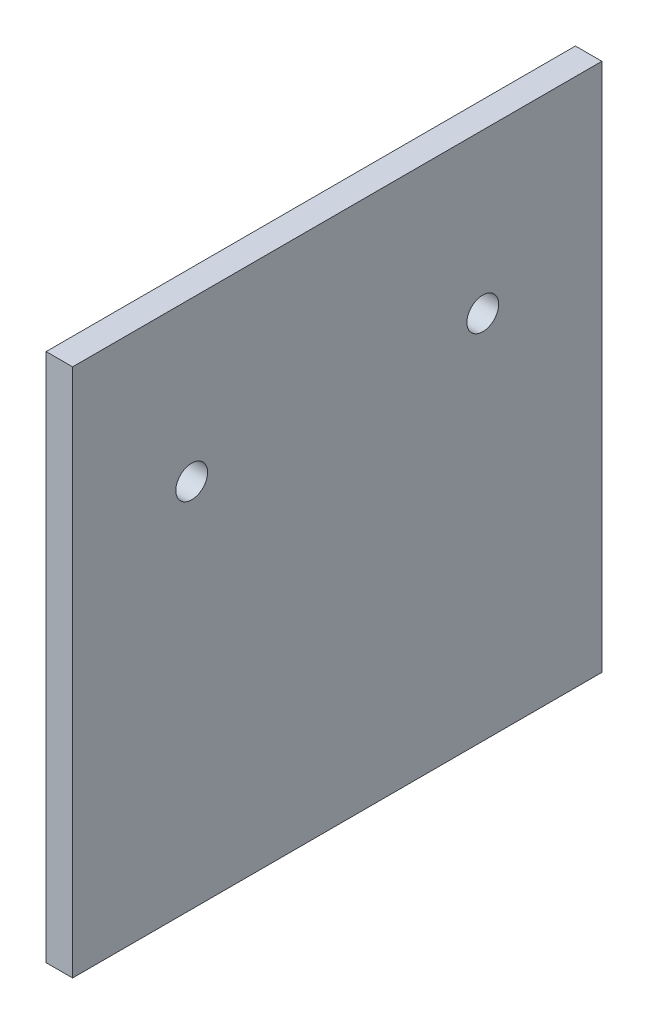
ISO-10303-21;
HEADER;
FILE_DESCRIPTION(('STEP AP214'),'2;1');
FILE_NAME('part.step','',(''),(''),'','','');
FILE_SCHEMA(('AUTOMOTIVE_DESIGN { 1 0 10303 214 1 1 1 1 }'));
ENDSEC;
DATA;
#1=APPLICATION_CONTEXT('core data for automotive mechanical design processes');
#2=APPLICATION_PROTOCOL_DEFINITION('international standard','automotive_design',2000,#1);
#3=PRODUCT_CONTEXT('',#1,'mechanical');
#4=PRODUCT('Part','Part','',(#3));
#5=PRODUCT_RELATED_PRODUCT_CATEGORY('part','',(#4));
#6=PRODUCT_DEFINITION_FORMATION('','',#4);
#7=PRODUCT_DEFINITION_CONTEXT('part definition',#1,'design');
#8=PRODUCT_DEFINITION('design','',#6,#7);
#9=PRODUCT_DEFINITION_SHAPE('','',#8);
#10=(LENGTH_UNIT() NAMED_UNIT(*) SI_UNIT(.MILLI.,.METRE.));
#11=(NAMED_UNIT(*) PLANE_ANGLE_UNIT() SI_UNIT($,.RADIAN.));
#12=(NAMED_UNIT(*) SI_UNIT($,.STERADIAN.) SOLID_ANGLE_UNIT());
#13=UNCERTAINTY_MEASURE_WITH_UNIT(LENGTH_MEASURE(1.E-05),#10,'distance_accuracy_value','');
#14=(GEOMETRIC_REPRESENTATION_CONTEXT(3) GLOBAL_UNCERTAINTY_ASSIGNED_CONTEXT((#13)) GLOBAL_UNIT_ASSIGNED_CONTEXT((#10,
#11,#12)) REPRESENTATION_CONTEXT('',''));
#15=CARTESIAN_POINT('',(0.,0.,0.));
#16=DIRECTION('',(0.,0.,1.));
#17=DIRECTION('',(1.,0.,0.));
#18=AXIS2_PLACEMENT_3D('',#15,#16,#17);
#19=CARTESIAN_POINT('',(10.,-100.,-100.));
#20=DIRECTION('',(0.,0.,1.));
#21=DIRECTION('',(1.,0.,0.));
#22=AXIS2_PLACEMENT_3D('',#19,#20,#21);
#23=PLANE('',#22);
#24=DIRECTION('',(0.,1.,0.));
#25=VECTOR('',#24,1.);
#26=CARTESIAN_POINT('',(0.,-100.,-100.));
#27=LINE('',#26,#25);
#28=CARTESIAN_POINT('',(0.,-100.,-100.));
#29=VERTEX_POINT('',#28);
#30=CARTESIAN_POINT('',(0.,100.,-100.));
#31=VERTEX_POINT('',#30);
#32=EDGE_CURVE('E96',#29,#31,#27,.T.);
#33=ORIENTED_EDGE('',*,*,#32,.T.);
#34=DIRECTION('',(-1.,0.,0.));
#35=VECTOR('',#34,1.);
#36=CARTESIAN_POINT('',(10.,100.,-100.));
#37=LINE('',#36,#35);
#38=CARTESIAN_POINT('',(10.,100.,-100.));
#39=VERTEX_POINT('',#38);
#40=EDGE_CURVE('E11',#39,#31,#37,.T.);
#41=ORIENTED_EDGE('',*,*,#40,.F.);
#42=DIRECTION('',(0.,1.,0.));
#43=VECTOR('',#42,1.);
#44=CARTESIAN_POINT('',(10.,-100.,-100.));
#45=LINE('',#44,#43);
#46=CARTESIAN_POINT('',(10.,-100.,-100.));
#47=VERTEX_POINT('',#46);
#48=EDGE_CURVE('E84',#47,#39,#45,.T.);
#49=ORIENTED_EDGE('',*,*,#48,.F.);
#50=DIRECTION('',(-1.,0.,0.));
#51=VECTOR('',#50,1.);
#52=CARTESIAN_POINT('',(10.,-100.,-100.));
#53=LINE('',#52,#51);
#54=EDGE_CURVE('E92',#47,#29,#53,.T.);
#55=ORIENTED_EDGE('',*,*,#54,.T.);
#56=EDGE_LOOP('',(#33,#41,#49,#55));
#57=FACE_BOUND('',#56,.T.);
#58=ADVANCED_FACE('F33',(#57),#23,.F.);
#59=CARTESIAN_POINT('',(10.,100.,100.));
#60=DIRECTION('',(0.,-1.,0.));
#61=DIRECTION('',(0.,0.,-1.));
#62=AXIS2_PLACEMENT_3D('',#59,#60,#61);
#63=PLANE('',#62);
#64=DIRECTION('',(0.,0.,1.));
#65=VECTOR('',#64,1.);
#66=CARTESIAN_POINT('',(0.,100.,100.));
#67=LINE('',#66,#65);
#68=CARTESIAN_POINT('',(0.,100.,100.));
#69=VERTEX_POINT('',#68);
#70=EDGE_CURVE('E88',#31,#69,#67,.T.);
#71=ORIENTED_EDGE('',*,*,#70,.T.);
#72=DIRECTION('',(-1.,0.,0.));
#73=VECTOR('',#72,1.);
#74=CARTESIAN_POINT('',(10.,100.,100.));
#75=LINE('',#74,#73);
#76=CARTESIAN_POINT('',(10.,100.,100.));
#77=VERTEX_POINT('',#76);
#78=EDGE_CURVE('E41',#77,#69,#75,.T.);
#79=ORIENTED_EDGE('',*,*,#78,.F.);
#80=DIRECTION('',(0.,0.,1.));
#81=VECTOR('',#80,1.);
#82=CARTESIAN_POINT('',(10.,100.,100.));
#83=LINE('',#82,#81);
#84=EDGE_CURVE('E79',#39,#77,#83,.T.);
#85=ORIENTED_EDGE('',*,*,#84,.F.);
#86=ORIENTED_EDGE('',*,*,#40,.T.);
#87=EDGE_LOOP('',(#71,#79,#85,#86));
#88=FACE_BOUND('',#87,.T.);
#89=ADVANCED_FACE('F87',(#88),#63,.F.);
#90=CARTESIAN_POINT('',(10.,-100.,100.));
#91=DIRECTION('',(0.,0.,-1.));
#92=DIRECTION('',(-1.,0.,0.));
#93=AXIS2_PLACEMENT_3D('',#90,#91,#92);
#94=PLANE('',#93);
#95=DIRECTION('',(0.,-1.,0.));
#96=VECTOR('',#95,1.);
#97=CARTESIAN_POINT('',(0.,-100.,100.));
#98=LINE('',#97,#96);
#99=CARTESIAN_POINT('',(0.,-100.,100.));
#100=VERTEX_POINT('',#99);
#101=EDGE_CURVE('E66',#69,#100,#98,.T.);
#102=ORIENTED_EDGE('',*,*,#101,.T.);
#103=DIRECTION('',(-1.,0.,0.));
#104=VECTOR('',#103,1.);
#105=CARTESIAN_POINT('',(10.,-100.,100.));
#106=LINE('',#105,#104);
#107=CARTESIAN_POINT('',(10.,-100.,100.));
#108=VERTEX_POINT('',#107);
#109=EDGE_CURVE('E89',#108,#100,#106,.T.);
#110=ORIENTED_EDGE('',*,*,#109,.F.);
#111=DIRECTION('',(0.,-1.,0.));
#112=VECTOR('',#111,1.);
#113=CARTESIAN_POINT('',(10.,-100.,100.));
#114=LINE('',#113,#112);
#115=EDGE_CURVE('E82',#77,#108,#114,.T.);
#116=ORIENTED_EDGE('',*,*,#115,.F.);
#117=ORIENTED_EDGE('',*,*,#78,.T.);
#118=EDGE_LOOP('',(#102,#110,#116,#117));
#119=FACE_BOUND('',#118,.T.);
#120=ADVANCED_FACE('F90',(#119),#94,.F.);
#121=CARTESIAN_POINT('',(10.,-100.,100.));
#122=DIRECTION('',(0.,1.,0.));
#123=DIRECTION('',(0.,0.,1.));
#124=AXIS2_PLACEMENT_3D('',#121,#122,#123);
#125=PLANE('',#124);
#126=DIRECTION('',(0.,0.,-1.));
#127=VECTOR('',#126,1.);
#128=CARTESIAN_POINT('',(0.,-100.,100.));
#129=LINE('',#128,#127);
#130=EDGE_CURVE('E72',#100,#29,#129,.T.);
#131=ORIENTED_EDGE('',*,*,#130,.T.);
#132=ORIENTED_EDGE('',*,*,#54,.F.);
#133=DIRECTION('',(0.,0.,-1.));
#134=VECTOR('',#133,1.);
#135=CARTESIAN_POINT('',(10.,-100.,100.));
#136=LINE('',#135,#134);
#137=EDGE_CURVE('E49',#108,#47,#136,.T.);
#138=ORIENTED_EDGE('',*,*,#137,.F.);
#139=ORIENTED_EDGE('',*,*,#109,.T.);
#140=EDGE_LOOP('',(#131,#132,#138,#139));
#141=FACE_BOUND('',#140,.T.);
#142=ADVANCED_FACE('F104',(#141),#125,.F.);
#143=CARTESIAN_POINT('',(10.,0.,0.));
#144=DIRECTION('',(-1.,0.,0.));
#145=DIRECTION('',(0.,0.,1.));
#146=AXIS2_PLACEMENT_3D('',#143,#144,#145);
#147=PLANE('',#146);
#148=CARTESIAN_POINT('',(10.,40.0000000000001,-55.));
#149=DIRECTION('',(1.,0.,0.));
#150=DIRECTION('',(0.,0.,-1.));
#151=AXIS2_PLACEMENT_3D('',#148,#149,#150);
#152=CIRCLE('',#151,6.);
#153=CARTESIAN_POINT('',(10.,40.0000000000001,-61.));
#154=VERTEX_POINT('',#153);
#155=EDGE_CURVE('E113',#154,#154,#152,.T.);
#156=ORIENTED_EDGE('',*,*,#155,.F.);
#157=EDGE_LOOP('',(#156));
#158=FACE_BOUND('',#157,.T.);
#159=CARTESIAN_POINT('',(10.,40.,55.));
#160=DIRECTION('',(1.,0.,0.));
#161=DIRECTION('',(0.,0.,-1.));
#162=AXIS2_PLACEMENT_3D('',#159,#160,#161);
#163=CIRCLE('',#162,6.00000000000001);
#164=CARTESIAN_POINT('',(10.,40.,49.));
#165=VERTEX_POINT('',#164);
#166=EDGE_CURVE('E99',#165,#165,#163,.T.);
#167=ORIENTED_EDGE('',*,*,#166,.F.);
#168=EDGE_LOOP('',(#167));
#169=FACE_BOUND('',#168,.T.);
#170=ORIENTED_EDGE('',*,*,#48,.T.);
#171=ORIENTED_EDGE('',*,*,#84,.T.);
#172=ORIENTED_EDGE('',*,*,#115,.T.);
#173=ORIENTED_EDGE('',*,*,#137,.T.);
#174=EDGE_LOOP('',(#170,#171,#172,#173));
#175=FACE_BOUND('',#174,.T.);
#176=ADVANCED_FACE('F80',(#158,#169,#175),#147,.F.);
#177=CARTESIAN_POINT('',(0.,0.,0.));
#178=DIRECTION('',(-1.,0.,0.));
#179=DIRECTION('',(0.,0.,1.));
#180=AXIS2_PLACEMENT_3D('',#177,#178,#179);
#181=PLANE('',#180);
#182=CARTESIAN_POINT('',(0.,40.0000000000001,-55.));
#183=DIRECTION('',(-1.,0.,0.));
#184=DIRECTION('',(0.,0.,1.));
#185=AXIS2_PLACEMENT_3D('',#182,#183,#184);
#186=CIRCLE('',#185,6.);
#187=CARTESIAN_POINT('',(0.,40.0000000000001,-49.));
#188=VERTEX_POINT('',#187);
#189=EDGE_CURVE('E116',#188,#188,#186,.F.);
#190=ORIENTED_EDGE('',*,*,#189,.T.);
#191=EDGE_LOOP('',(#190));
#192=FACE_BOUND('',#191,.T.);
#193=CARTESIAN_POINT('',(0.,40.,55.));
#194=DIRECTION('',(-1.,0.,0.));
#195=DIRECTION('',(0.,0.,1.));
#196=AXIS2_PLACEMENT_3D('',#193,#194,#195);
#197=CIRCLE('',#196,6.00000000000001);
#198=CARTESIAN_POINT('',(0.,40.,61.));
#199=VERTEX_POINT('',#198);
#200=EDGE_CURVE('E110',#199,#199,#197,.F.);
#201=ORIENTED_EDGE('',*,*,#200,.T.);
#202=EDGE_LOOP('',(#201));
#203=FACE_BOUND('',#202,.T.);
#204=ORIENTED_EDGE('',*,*,#32,.F.);
#205=ORIENTED_EDGE('',*,*,#130,.F.);
#206=ORIENTED_EDGE('',*,*,#101,.F.);
#207=ORIENTED_EDGE('',*,*,#70,.F.);
#208=EDGE_LOOP('',(#204,#205,#206,#207));
#209=FACE_BOUND('',#208,.T.);
#210=ADVANCED_FACE('F107',(#192,#203,#209),#181,.T.);
#211=CARTESIAN_POINT('',(-0.000999999999999265,40.,55.));
#212=DIRECTION('',(1.,0.,0.));
#213=DIRECTION('',(0.,0.,-1.));
#214=AXIS2_PLACEMENT_3D('',#211,#212,#213);
#215=CYLINDRICAL_SURFACE('',#214,6.00000000000001);
#216=ORIENTED_EDGE('',*,*,#200,.F.);
#217=EDGE_LOOP('',(#216));
#218=FACE_BOUND('',#217,.T.);
#219=ORIENTED_EDGE('',*,*,#166,.T.);
#220=EDGE_LOOP('',(#219));
#221=FACE_BOUND('',#220,.T.);
#222=ADVANCED_FACE('F129',(#218,#221),#215,.F.);
#223=CARTESIAN_POINT('',(-0.000999999999999265,40.0000000000001,-55.));
#224=DIRECTION('',(1.,0.,0.));
#225=DIRECTION('',(0.,0.,-1.));
#226=AXIS2_PLACEMENT_3D('',#223,#224,#225);
#227=CYLINDRICAL_SURFACE('',#226,6.);
#228=ORIENTED_EDGE('',*,*,#189,.F.);
#229=EDGE_LOOP('',(#228));
#230=FACE_BOUND('',#229,.T.);
#231=ORIENTED_EDGE('',*,*,#155,.T.);
#232=EDGE_LOOP('',(#231));
#233=FACE_BOUND('',#232,.T.);
#234=ADVANCED_FACE('F122',(#230,#233),#227,.F.);
#235=CLOSED_SHELL('',(#58,#89,#120,#142,#176,#210,#222,#234));
#236=MANIFOLD_SOLID_BREP('B2',#235);
#237=ADVANCED_BREP_SHAPE_REPRESENTATION('',(#18,#236),#14);
#238=SHAPE_DEFINITION_REPRESENTATION(#9,#237);
ENDSEC;
END-ISO-10303-21;
